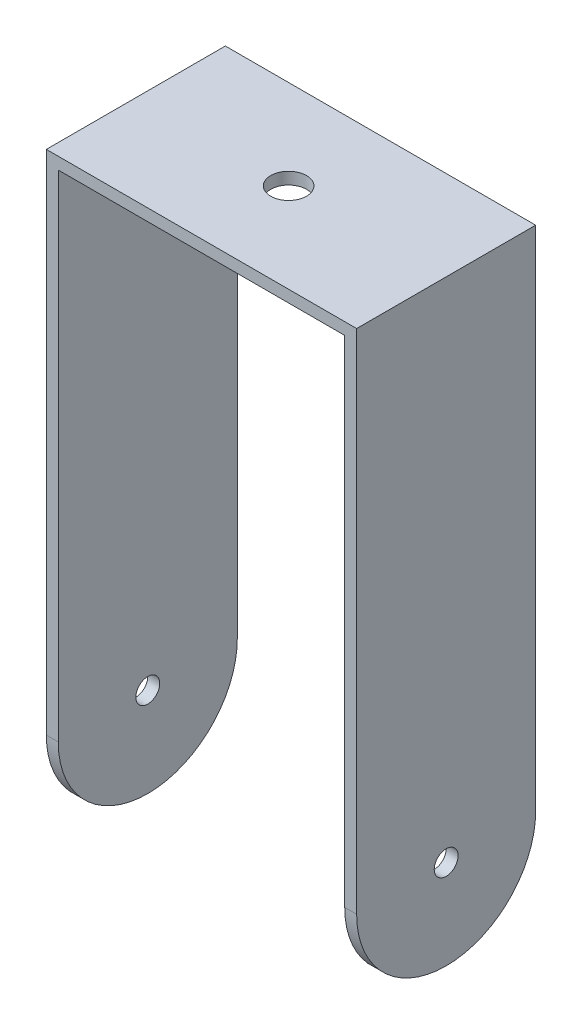
ISO-10303-21;
HEADER;
FILE_DESCRIPTION(('STEP AP214'),'2;1');
FILE_NAME('part.step','',(''),(''),'','','');
FILE_SCHEMA(('AUTOMOTIVE_DESIGN { 1 0 10303 214 1 1 1 1 }'));
ENDSEC;
DATA;
#1=APPLICATION_CONTEXT('core data for automotive mechanical design processes');
#2=APPLICATION_PROTOCOL_DEFINITION('international standard','automotive_design',2000,#1);
#3=PRODUCT_CONTEXT('',#1,'mechanical');
#4=PRODUCT('Part','Part','',(#3));
#5=PRODUCT_RELATED_PRODUCT_CATEGORY('part','',(#4));
#6=PRODUCT_DEFINITION_FORMATION('','',#4);
#7=PRODUCT_DEFINITION_CONTEXT('part definition',#1,'design');
#8=PRODUCT_DEFINITION('design','',#6,#7);
#9=PRODUCT_DEFINITION_SHAPE('','',#8);
#10=(LENGTH_UNIT() NAMED_UNIT(*) SI_UNIT(.MILLI.,.METRE.));
#11=(NAMED_UNIT(*) PLANE_ANGLE_UNIT() SI_UNIT($,.RADIAN.));
#12=(NAMED_UNIT(*) SI_UNIT($,.STERADIAN.) SOLID_ANGLE_UNIT());
#13=UNCERTAINTY_MEASURE_WITH_UNIT(LENGTH_MEASURE(1.E-05),#10,'distance_accuracy_value','');
#14=(GEOMETRIC_REPRESENTATION_CONTEXT(3) GLOBAL_UNCERTAINTY_ASSIGNED_CONTEXT((#13)) GLOBAL_UNIT_ASSIGNED_CONTEXT((#10,
#11,#12)) REPRESENTATION_CONTEXT('',''));
#15=CARTESIAN_POINT('',(0.,0.,0.));
#16=DIRECTION('',(0.,0.,1.));
#17=DIRECTION('',(1.,0.,0.));
#18=AXIS2_PLACEMENT_3D('',#15,#16,#17);
#19=CARTESIAN_POINT('',(0.,0.,75.));
#20=DIRECTION('',(1.,0.,0.));
#21=DIRECTION('',(0.,0.,-1.));
#22=AXIS2_PLACEMENT_3D('',#19,#20,#21);
#23=PLANE('',#22);
#24=CARTESIAN_POINT('',(0.,-212.5,37.5));
#25=DIRECTION('',(1.,0.,0.));
#26=DIRECTION('',(0.,0.,-1.));
#27=AXIS2_PLACEMENT_3D('',#24,#25,#26);
#28=CIRCLE('',#27,5.);
#29=CARTESIAN_POINT('',(0.,-212.5,32.5));
#30=VERTEX_POINT('',#29);
#31=EDGE_CURVE('E231',#30,#30,#28,.T.);
#32=ORIENTED_EDGE('',*,*,#31,.T.);
#33=EDGE_LOOP('',(#32));
#34=FACE_BOUND('',#33,.T.);
#35=CARTESIAN_POINT('',(0.,-212.5,37.5));
#36=DIRECTION('',(1.,0.,0.));
#37=DIRECTION('',(0.,0.,-1.));
#38=AXIS2_PLACEMENT_3D('',#35,#36,#37);
#39=CIRCLE('',#38,37.5);
#40=CARTESIAN_POINT('',(0.,-212.5,0.));
#41=VERTEX_POINT('',#40);
#42=CARTESIAN_POINT('',(0.,-250.,37.5));
#43=VERTEX_POINT('',#42);
#44=EDGE_CURVE('E54',#41,#43,#39,.F.);
#45=ORIENTED_EDGE('',*,*,#44,.T.);
#46=CARTESIAN_POINT('',(0.,-212.5,37.5));
#47=DIRECTION('',(1.,0.,0.));
#48=DIRECTION('',(0.,0.,-1.));
#49=AXIS2_PLACEMENT_3D('',#46,#47,#48);
#50=CIRCLE('',#49,37.5);
#51=CARTESIAN_POINT('',(0.,-212.5,75.));
#52=VERTEX_POINT('',#51);
#53=EDGE_CURVE('E186',#43,#52,#50,.F.);
#54=ORIENTED_EDGE('',*,*,#53,.T.);
#55=DIRECTION('',(0.,-1.,0.));
#56=VECTOR('',#55,1.);
#57=CARTESIAN_POINT('',(0.,0.,75.));
#58=LINE('',#57,#56);
#59=CARTESIAN_POINT('',(0.,0.,75.));
#60=VERTEX_POINT('',#59);
#61=EDGE_CURVE('E127',#60,#52,#58,.T.);
#62=ORIENTED_EDGE('',*,*,#61,.F.);
#63=DIRECTION('',(0.,0.,-1.));
#64=VECTOR('',#63,1.);
#65=CARTESIAN_POINT('',(0.,0.,75.));
#66=LINE('',#65,#64);
#67=CARTESIAN_POINT('',(0.,0.,0.));
#68=VERTEX_POINT('',#67);
#69=EDGE_CURVE('E149',#60,#68,#66,.T.);
#70=ORIENTED_EDGE('',*,*,#69,.T.);
#71=DIRECTION('',(0.,-1.,0.));
#72=VECTOR('',#71,1.);
#73=CARTESIAN_POINT('',(0.,0.,0.));
#74=LINE('',#73,#72);
#75=EDGE_CURVE('E150',#68,#41,#74,.T.);
#76=ORIENTED_EDGE('',*,*,#75,.T.);
#77=EDGE_LOOP('',(#45,#54,#62,#70,#76));
#78=FACE_BOUND('',#77,.T.);
#79=ADVANCED_FACE('F37',(#34,#78),#23,.F.);
#80=CARTESIAN_POINT('',(5.,-5.,75.));
#81=DIRECTION('',(-1.,0.,0.));
#82=DIRECTION('',(0.,-1.,0.));
#83=AXIS2_PLACEMENT_3D('',#80,#81,#82);
#84=PLANE('',#83);
#85=CARTESIAN_POINT('',(5.00000000000002,-212.5,37.5));
#86=DIRECTION('',(-1.,0.,0.));
#87=DIRECTION('',(0.,-1.,0.));
#88=AXIS2_PLACEMENT_3D('',#85,#86,#87);
#89=CIRCLE('',#88,5.);
#90=CARTESIAN_POINT('',(5.00000000000003,-217.5,37.5));
#91=VERTEX_POINT('',#90);
#92=EDGE_CURVE('E234',#91,#91,#89,.T.);
#93=ORIENTED_EDGE('',*,*,#92,.T.);
#94=EDGE_LOOP('',(#93));
#95=FACE_BOUND('',#94,.T.);
#96=DIRECTION('',(0.,1.,0.));
#97=VECTOR('',#96,1.);
#98=CARTESIAN_POINT('',(5.,-5.,75.));
#99=LINE('',#98,#97);
#100=CARTESIAN_POINT('',(5.00000000000003,-212.5,75.));
#101=VERTEX_POINT('',#100);
#102=CARTESIAN_POINT('',(5.,-5.,75.));
#103=VERTEX_POINT('',#102);
#104=EDGE_CURVE('E116',#101,#103,#99,.T.);
#105=ORIENTED_EDGE('',*,*,#104,.F.);
#106=CARTESIAN_POINT('',(5.00000000000003,-212.5,37.5));
#107=DIRECTION('',(-1.,0.,0.));
#108=DIRECTION('',(0.,-1.,0.));
#109=AXIS2_PLACEMENT_3D('',#106,#107,#108);
#110=CIRCLE('',#109,37.5);
#111=CARTESIAN_POINT('',(5.00000000000003,-250.,37.5));
#112=VERTEX_POINT('',#111);
#113=EDGE_CURVE('E183',#101,#112,#110,.F.);
#114=ORIENTED_EDGE('',*,*,#113,.T.);
#115=CARTESIAN_POINT('',(5.00000000000003,-212.5,37.5));
#116=DIRECTION('',(-1.,0.,0.));
#117=DIRECTION('',(0.,-1.,0.));
#118=AXIS2_PLACEMENT_3D('',#115,#116,#117);
#119=CIRCLE('',#118,37.5);
#120=CARTESIAN_POINT('',(5.00000000000003,-212.5,0.));
#121=VERTEX_POINT('',#120);
#122=EDGE_CURVE('E181',#112,#121,#119,.F.);
#123=ORIENTED_EDGE('',*,*,#122,.T.);
#124=DIRECTION('',(0.,1.,0.));
#125=VECTOR('',#124,1.);
#126=CARTESIAN_POINT('',(5.,-5.,0.));
#127=LINE('',#126,#125);
#128=CARTESIAN_POINT('',(5.,-5.,0.));
#129=VERTEX_POINT('',#128);
#130=EDGE_CURVE('E132',#121,#129,#127,.T.);
#131=ORIENTED_EDGE('',*,*,#130,.T.);
#132=DIRECTION('',(0.,0.,-1.));
#133=VECTOR('',#132,1.);
#134=CARTESIAN_POINT('',(5.,-5.,75.));
#135=LINE('',#134,#133);
#136=EDGE_CURVE('E130',#103,#129,#135,.T.);
#137=ORIENTED_EDGE('',*,*,#136,.F.);
#138=EDGE_LOOP('',(#105,#114,#123,#131,#137));
#139=FACE_BOUND('',#138,.T.);
#140=ADVANCED_FACE('F131',(#95,#139),#84,.F.);
#141=CARTESIAN_POINT('',(5.,-5.,75.));
#142=DIRECTION('',(0.,1.,0.));
#143=DIRECTION('',(0.,0.,1.));
#144=AXIS2_PLACEMENT_3D('',#141,#142,#143);
#145=PLANE('',#144);
#146=CARTESIAN_POINT('',(64.,-5.,37.5));
#147=DIRECTION('',(0.,1.,0.));
#148=DIRECTION('',(0.,0.,1.));
#149=AXIS2_PLACEMENT_3D('',#146,#147,#148);
#150=CIRCLE('',#149,7.50000000000001);
#151=CARTESIAN_POINT('',(64.,-5.,45.));
#152=VERTEX_POINT('',#151);
#153=EDGE_CURVE('E152',#152,#152,#150,.T.);
#154=ORIENTED_EDGE('',*,*,#153,.T.);
#155=EDGE_LOOP('',(#154));
#156=FACE_BOUND('',#155,.T.);
#157=DIRECTION('',(1.,0.,0.));
#158=VECTOR('',#157,1.);
#159=CARTESIAN_POINT('',(5.,-5.,0.));
#160=LINE('',#159,#158);
#161=CARTESIAN_POINT('',(125.,-5.,0.));
#162=VERTEX_POINT('',#161);
#163=EDGE_CURVE('E154',#129,#162,#160,.T.);
#164=ORIENTED_EDGE('',*,*,#163,.T.);
#165=DIRECTION('',(0.,0.,-1.));
#166=VECTOR('',#165,1.);
#167=CARTESIAN_POINT('',(125.,-5.,75.));
#168=LINE('',#167,#166);
#169=CARTESIAN_POINT('',(125.,-5.,75.));
#170=VERTEX_POINT('',#169);
#171=EDGE_CURVE('E135',#170,#162,#168,.T.);
#172=ORIENTED_EDGE('',*,*,#171,.F.);
#173=DIRECTION('',(1.,0.,0.));
#174=VECTOR('',#173,1.);
#175=CARTESIAN_POINT('',(5.,-5.,75.));
#176=LINE('',#175,#174);
#177=EDGE_CURVE('E121',#103,#170,#176,.T.);
#178=ORIENTED_EDGE('',*,*,#177,.F.);
#179=ORIENTED_EDGE('',*,*,#136,.T.);
#180=EDGE_LOOP('',(#164,#172,#178,#179));
#181=FACE_BOUND('',#180,.T.);
#182=ADVANCED_FACE('F137',(#156,#181),#145,.F.);
#183=CARTESIAN_POINT('',(125.,-5.,75.));
#184=DIRECTION('',(1.,0.,0.));
#185=DIRECTION('',(0.,1.,0.));
#186=AXIS2_PLACEMENT_3D('',#183,#184,#185);
#187=PLANE('',#186);
#188=CARTESIAN_POINT('',(125.,-212.5,37.5));
#189=DIRECTION('',(1.,0.,0.));
#190=DIRECTION('',(0.,1.,0.));
#191=AXIS2_PLACEMENT_3D('',#188,#189,#190);
#192=CIRCLE('',#191,5.);
#193=CARTESIAN_POINT('',(125.,-207.5,37.5));
#194=VERTEX_POINT('',#193);
#195=EDGE_CURVE('E195',#194,#194,#192,.T.);
#196=ORIENTED_EDGE('',*,*,#195,.T.);
#197=EDGE_LOOP('',(#196));
#198=FACE_BOUND('',#197,.T.);
#199=CARTESIAN_POINT('',(125.,-212.5,37.5));
#200=DIRECTION('',(1.,0.,0.));
#201=DIRECTION('',(0.,1.,0.));
#202=AXIS2_PLACEMENT_3D('',#199,#200,#201);
#203=CIRCLE('',#202,37.5);
#204=CARTESIAN_POINT('',(125.,-212.5,0.));
#205=VERTEX_POINT('',#204);
#206=CARTESIAN_POINT('',(125.,-250.,37.5));
#207=VERTEX_POINT('',#206);
#208=EDGE_CURVE('E177',#205,#207,#203,.F.);
#209=ORIENTED_EDGE('',*,*,#208,.T.);
#210=CARTESIAN_POINT('',(125.,-212.5,37.5));
#211=DIRECTION('',(1.,0.,0.));
#212=DIRECTION('',(0.,1.,0.));
#213=AXIS2_PLACEMENT_3D('',#210,#211,#212);
#214=CIRCLE('',#213,37.5);
#215=CARTESIAN_POINT('',(125.,-212.5,75.));
#216=VERTEX_POINT('',#215);
#217=EDGE_CURVE('E179',#207,#216,#214,.F.);
#218=ORIENTED_EDGE('',*,*,#217,.T.);
#219=DIRECTION('',(0.,-1.,0.));
#220=VECTOR('',#219,1.);
#221=CARTESIAN_POINT('',(125.,-5.,75.));
#222=LINE('',#221,#220);
#223=EDGE_CURVE('E140',#170,#216,#222,.T.);
#224=ORIENTED_EDGE('',*,*,#223,.F.);
#225=ORIENTED_EDGE('',*,*,#171,.T.);
#226=DIRECTION('',(0.,-1.,0.));
#227=VECTOR('',#226,1.);
#228=CARTESIAN_POINT('',(125.,-5.,0.));
#229=LINE('',#228,#227);
#230=EDGE_CURVE('E156',#162,#205,#229,.T.);
#231=ORIENTED_EDGE('',*,*,#230,.T.);
#232=EDGE_LOOP('',(#209,#218,#224,#225,#231));
#233=FACE_BOUND('',#232,.T.);
#234=ADVANCED_FACE('F206',(#198,#233),#187,.F.);
#235=CARTESIAN_POINT('',(130.,0.,75.));
#236=DIRECTION('',(-1.,0.,0.));
#237=DIRECTION('',(0.,-1.,0.));
#238=AXIS2_PLACEMENT_3D('',#235,#236,#237);
#239=PLANE('',#238);
#240=CARTESIAN_POINT('',(130.,-212.5,37.5));
#241=DIRECTION('',(1.,0.,0.));
#242=DIRECTION('',(0.,1.,0.));
#243=AXIS2_PLACEMENT_3D('',#240,#241,#242);
#244=CIRCLE('',#243,5.);
#245=CARTESIAN_POINT('',(130.,-207.5,37.5));
#246=VERTEX_POINT('',#245);
#247=EDGE_CURVE('E190',#246,#246,#244,.T.);
#248=ORIENTED_EDGE('',*,*,#247,.F.);
#249=EDGE_LOOP('',(#248));
#250=FACE_BOUND('',#249,.T.);
#251=DIRECTION('',(0.,1.,0.));
#252=VECTOR('',#251,1.);
#253=CARTESIAN_POINT('',(130.,0.,75.));
#254=LINE('',#253,#252);
#255=CARTESIAN_POINT('',(130.,-212.5,75.));
#256=VERTEX_POINT('',#255);
#257=CARTESIAN_POINT('',(130.,0.,75.));
#258=VERTEX_POINT('',#257);
#259=EDGE_CURVE('E142',#256,#258,#254,.T.);
#260=ORIENTED_EDGE('',*,*,#259,.F.);
#261=CARTESIAN_POINT('',(130.,-212.5,37.5));
#262=DIRECTION('',(-1.,0.,0.));
#263=DIRECTION('',(0.,-1.,0.));
#264=AXIS2_PLACEMENT_3D('',#261,#262,#263);
#265=CIRCLE('',#264,37.5);
#266=CARTESIAN_POINT('',(130.,-250.,37.5));
#267=VERTEX_POINT('',#266);
#268=EDGE_CURVE('E175',#256,#267,#265,.F.);
#269=ORIENTED_EDGE('',*,*,#268,.T.);
#270=CARTESIAN_POINT('',(130.,-212.5,37.5));
#271=DIRECTION('',(-1.,0.,0.));
#272=DIRECTION('',(0.,-1.,0.));
#273=AXIS2_PLACEMENT_3D('',#270,#271,#272);
#274=CIRCLE('',#273,37.5);
#275=CARTESIAN_POINT('',(130.,-212.5,0.));
#276=VERTEX_POINT('',#275);
#277=EDGE_CURVE('E173',#267,#276,#274,.F.);
#278=ORIENTED_EDGE('',*,*,#277,.T.);
#279=DIRECTION('',(0.,1.,0.));
#280=VECTOR('',#279,1.);
#281=CARTESIAN_POINT('',(130.,0.,0.));
#282=LINE('',#281,#280);
#283=CARTESIAN_POINT('',(130.,0.,0.));
#284=VERTEX_POINT('',#283);
#285=EDGE_CURVE('E159',#276,#284,#282,.T.);
#286=ORIENTED_EDGE('',*,*,#285,.T.);
#287=DIRECTION('',(0.,0.,-1.));
#288=VECTOR('',#287,1.);
#289=CARTESIAN_POINT('',(130.,0.,75.));
#290=LINE('',#289,#288);
#291=EDGE_CURVE('E165',#258,#284,#290,.T.);
#292=ORIENTED_EDGE('',*,*,#291,.F.);
#293=EDGE_LOOP('',(#260,#269,#278,#286,#292));
#294=FACE_BOUND('',#293,.T.);
#295=ADVANCED_FACE('F213',(#250,#294),#239,.F.);
#296=CARTESIAN_POINT('',(0.,0.,75.));
#297=DIRECTION('',(0.,-1.,0.));
#298=DIRECTION('',(0.,0.,-1.));
#299=AXIS2_PLACEMENT_3D('',#296,#297,#298);
#300=PLANE('',#299);
#301=CARTESIAN_POINT('',(64.,0.,37.5));
#302=DIRECTION('',(0.,1.,0.));
#303=DIRECTION('',(0.,0.,1.));
#304=AXIS2_PLACEMENT_3D('',#301,#302,#303);
#305=CIRCLE('',#304,7.50000000000001);
#306=CARTESIAN_POINT('',(64.,0.,45.));
#307=VERTEX_POINT('',#306);
#308=EDGE_CURVE('E228',#307,#307,#305,.T.);
#309=ORIENTED_EDGE('',*,*,#308,.F.);
#310=EDGE_LOOP('',(#309));
#311=FACE_BOUND('',#310,.T.);
#312=DIRECTION('',(-1.,0.,0.));
#313=VECTOR('',#312,1.);
#314=CARTESIAN_POINT('',(0.,0.,0.));
#315=LINE('',#314,#313);
#316=EDGE_CURVE('E161',#284,#68,#315,.T.);
#317=ORIENTED_EDGE('',*,*,#316,.T.);
#318=ORIENTED_EDGE('',*,*,#69,.F.);
#319=DIRECTION('',(-1.,0.,0.));
#320=VECTOR('',#319,1.);
#321=CARTESIAN_POINT('',(0.,0.,75.));
#322=LINE('',#321,#320);
#323=EDGE_CURVE('E147',#258,#60,#322,.T.);
#324=ORIENTED_EDGE('',*,*,#323,.F.);
#325=ORIENTED_EDGE('',*,*,#291,.T.);
#326=EDGE_LOOP('',(#317,#318,#324,#325));
#327=FACE_BOUND('',#326,.T.);
#328=ADVANCED_FACE('F222',(#311,#327),#300,.F.);
#329=CARTESIAN_POINT('',(0.,0.,75.));
#330=DIRECTION('',(0.,0.,1.));
#331=DIRECTION('',(1.,0.,0.));
#332=AXIS2_PLACEMENT_3D('',#329,#330,#331);
#333=PLANE('',#332);
#334=ORIENTED_EDGE('',*,*,#223,.T.);
#335=DIRECTION('',(1.,0.,0.));
#336=VECTOR('',#335,1.);
#337=CARTESIAN_POINT('',(130.,-212.5,75.));
#338=LINE('',#337,#336);
#339=EDGE_CURVE('E170',#216,#256,#338,.T.);
#340=ORIENTED_EDGE('',*,*,#339,.T.);
#341=ORIENTED_EDGE('',*,*,#259,.T.);
#342=ORIENTED_EDGE('',*,*,#323,.T.);
#343=ORIENTED_EDGE('',*,*,#61,.T.);
#344=DIRECTION('',(1.,0.,0.));
#345=VECTOR('',#344,1.);
#346=CARTESIAN_POINT('',(5.00000000000003,-212.5,75.));
#347=LINE('',#346,#345);
#348=EDGE_CURVE('E125',#52,#101,#347,.T.);
#349=ORIENTED_EDGE('',*,*,#348,.T.);
#350=ORIENTED_EDGE('',*,*,#104,.T.);
#351=ORIENTED_EDGE('',*,*,#177,.T.);
#352=EDGE_LOOP('',(#334,#340,#341,#342,#343,#349,#350,#351));
#353=FACE_BOUND('',#352,.T.);
#354=ADVANCED_FACE('F119',(#353),#333,.T.);
#355=CARTESIAN_POINT('',(0.,0.,0.));
#356=DIRECTION('',(0.,0.,1.));
#357=DIRECTION('',(1.,0.,0.));
#358=AXIS2_PLACEMENT_3D('',#355,#356,#357);
#359=PLANE('',#358);
#360=ORIENTED_EDGE('',*,*,#130,.F.);
#361=DIRECTION('',(1.,0.,0.));
#362=VECTOR('',#361,1.);
#363=CARTESIAN_POINT('',(0.,-212.5,0.));
#364=LINE('',#363,#362);
#365=EDGE_CURVE('E11',#121,#41,#364,.F.);
#366=ORIENTED_EDGE('',*,*,#365,.T.);
#367=ORIENTED_EDGE('',*,*,#75,.F.);
#368=ORIENTED_EDGE('',*,*,#316,.F.);
#369=ORIENTED_EDGE('',*,*,#285,.F.);
#370=DIRECTION('',(1.,0.,0.));
#371=VECTOR('',#370,1.);
#372=CARTESIAN_POINT('',(0.,-212.5,0.));
#373=LINE('',#372,#371);
#374=EDGE_CURVE('E46',#276,#205,#373,.F.);
#375=ORIENTED_EDGE('',*,*,#374,.T.);
#376=ORIENTED_EDGE('',*,*,#230,.F.);
#377=ORIENTED_EDGE('',*,*,#163,.F.);
#378=EDGE_LOOP('',(#360,#366,#367,#368,#369,#375,#376,#377));
#379=FACE_BOUND('',#378,.T.);
#380=ADVANCED_FACE('F203',(#379),#359,.F.);
#381=CARTESIAN_POINT('',(64.,-8.,37.5));
#382=DIRECTION('',(0.,1.,0.));
#383=DIRECTION('',(0.,0.,1.));
#384=AXIS2_PLACEMENT_3D('',#381,#382,#383);
#385=CYLINDRICAL_SURFACE('',#384,7.50000000000001);
#386=ORIENTED_EDGE('',*,*,#308,.T.);
#387=EDGE_LOOP('',(#386));
#388=FACE_BOUND('',#387,.T.);
#389=ORIENTED_EDGE('',*,*,#153,.F.);
#390=EDGE_LOOP('',(#389));
#391=FACE_BOUND('',#390,.T.);
#392=ADVANCED_FACE('F244',(#388,#391),#385,.F.);
#393=CARTESIAN_POINT('',(-3.99999999999995,-212.5,37.5));
#394=DIRECTION('',(1.,0.,0.));
#395=DIRECTION('',(0.,1.,0.));
#396=AXIS2_PLACEMENT_3D('',#393,#394,#395);
#397=CYLINDRICAL_SURFACE('',#396,5.);
#398=ORIENTED_EDGE('',*,*,#247,.T.);
#399=EDGE_LOOP('',(#398));
#400=FACE_BOUND('',#399,.T.);
#401=ORIENTED_EDGE('',*,*,#195,.F.);
#402=EDGE_LOOP('',(#401));
#403=FACE_BOUND('',#402,.T.);
#404=ADVANCED_FACE('F241',(#400,#403),#397,.F.);
#405=ORIENTED_EDGE('',*,*,#92,.F.);
#406=EDGE_LOOP('',(#405));
#407=FACE_BOUND('',#406,.T.);
#408=ORIENTED_EDGE('',*,*,#31,.F.);
#409=EDGE_LOOP('',(#408));
#410=FACE_BOUND('',#409,.T.);
#411=ADVANCED_FACE('F243',(#407,#410),#397,.F.);
#412=CARTESIAN_POINT('',(125.,-212.5,37.5));
#413=DIRECTION('',(1.,0.,0.));
#414=DIRECTION('',(0.,0.,-1.));
#415=AXIS2_PLACEMENT_3D('',#412,#413,#414);
#416=CYLINDRICAL_SURFACE('',#415,37.5);
#417=DIRECTION('',(1.,0.,0.));
#418=VECTOR('',#417,1.);
#419=CARTESIAN_POINT('',(125.,-250.,37.5));
#420=LINE('',#419,#418);
#421=EDGE_CURVE('E188',#207,#267,#420,.T.);
#422=ORIENTED_EDGE('',*,*,#421,.F.);
#423=ORIENTED_EDGE('',*,*,#208,.F.);
#424=ORIENTED_EDGE('',*,*,#374,.F.);
#425=ORIENTED_EDGE('',*,*,#277,.F.);
#426=EDGE_LOOP('',(#422,#423,#424,#425));
#427=FACE_BOUND('',#426,.T.);
#428=ADVANCED_FACE('F218',(#427),#416,.T.);
#429=CARTESIAN_POINT('',(0.,-212.5,37.5));
#430=DIRECTION('',(-1.,0.,0.));
#431=DIRECTION('',(0.,0.,1.));
#432=AXIS2_PLACEMENT_3D('',#429,#430,#431);
#433=CYLINDRICAL_SURFACE('',#432,37.5);
#434=ORIENTED_EDGE('',*,*,#217,.F.);
#435=ORIENTED_EDGE('',*,*,#421,.T.);
#436=ORIENTED_EDGE('',*,*,#268,.F.);
#437=ORIENTED_EDGE('',*,*,#339,.F.);
#438=EDGE_LOOP('',(#434,#435,#436,#437));
#439=FACE_BOUND('',#438,.T.);
#440=ADVANCED_FACE('F210',(#439),#433,.T.);
#441=CARTESIAN_POINT('',(0.,-212.5,37.5));
#442=DIRECTION('',(1.,0.,0.));
#443=DIRECTION('',(0.,0.,-1.));
#444=AXIS2_PLACEMENT_3D('',#441,#442,#443);
#445=CYLINDRICAL_SURFACE('',#444,37.5);
#446=DIRECTION('',(1.,0.,0.));
#447=VECTOR('',#446,1.);
#448=CARTESIAN_POINT('',(0.,-250.,37.5));
#449=LINE('',#448,#447);
#450=EDGE_CURVE('E41',#43,#112,#449,.T.);
#451=ORIENTED_EDGE('',*,*,#450,.F.);
#452=ORIENTED_EDGE('',*,*,#44,.F.);
#453=ORIENTED_EDGE('',*,*,#365,.F.);
#454=ORIENTED_EDGE('',*,*,#122,.F.);
#455=EDGE_LOOP('',(#451,#452,#453,#454));
#456=FACE_BOUND('',#455,.T.);
#457=ADVANCED_FACE('F39',(#456),#445,.T.);
#458=CARTESIAN_POINT('',(0.,-212.5,37.5));
#459=DIRECTION('',(-1.,0.,0.));
#460=DIRECTION('',(0.,0.,1.));
#461=AXIS2_PLACEMENT_3D('',#458,#459,#460);
#462=CYLINDRICAL_SURFACE('',#461,37.5);
#463=ORIENTED_EDGE('',*,*,#53,.F.);
#464=ORIENTED_EDGE('',*,*,#450,.T.);
#465=ORIENTED_EDGE('',*,*,#113,.F.);
#466=ORIENTED_EDGE('',*,*,#348,.F.);
#467=EDGE_LOOP('',(#463,#464,#465,#466));
#468=FACE_BOUND('',#467,.T.);
#469=ADVANCED_FACE('F200',(#468),#462,.T.);
#470=CLOSED_SHELL('',(#79,#140,#182,#234,#295,#328,#354,#380,#392,#404,#411,#428,#440,#457,#469));
#471=MANIFOLD_SOLID_BREP('B2',#470);
#472=ADVANCED_BREP_SHAPE_REPRESENTATION('',(#18,#471),#14);
#473=SHAPE_DEFINITION_REPRESENTATION(#9,#472);
ENDSEC;
END-ISO-10303-21;
